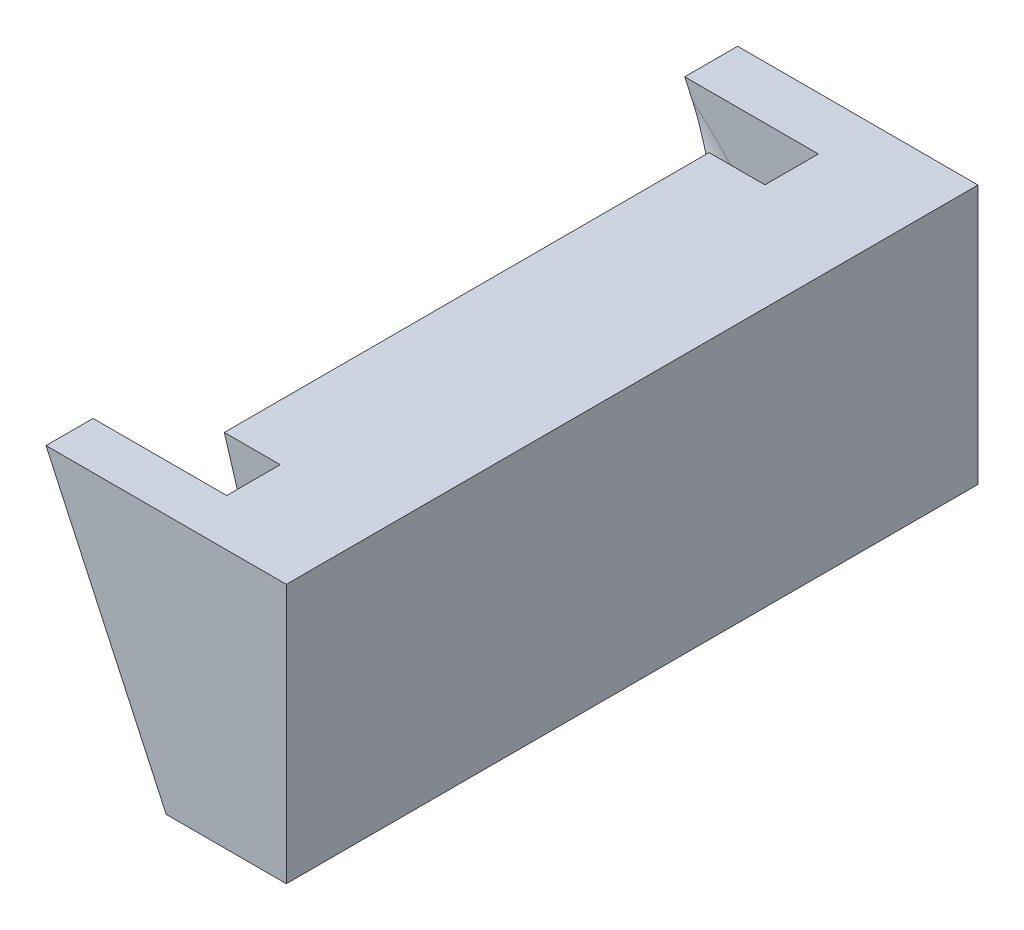
ISO-10303-21;
HEADER;
FILE_DESCRIPTION(('STEP AP214'),'2;1');
FILE_NAME('part.step','',(''),(''),'','','');
FILE_SCHEMA(('AUTOMOTIVE_DESIGN { 1 0 10303 214 1 1 1 1 }'));
ENDSEC;
DATA;
#1=APPLICATION_CONTEXT('core data for automotive mechanical design processes');
#2=APPLICATION_PROTOCOL_DEFINITION('international standard','automotive_design',2000,#1);
#3=PRODUCT_CONTEXT('',#1,'mechanical');
#4=PRODUCT('Part','Part','',(#3));
#5=PRODUCT_RELATED_PRODUCT_CATEGORY('part','',(#4));
#6=PRODUCT_DEFINITION_FORMATION('','',#4);
#7=PRODUCT_DEFINITION_CONTEXT('part definition',#1,'design');
#8=PRODUCT_DEFINITION('design','',#6,#7);
#9=PRODUCT_DEFINITION_SHAPE('','',#8);
#10=(LENGTH_UNIT() NAMED_UNIT(*) SI_UNIT(.MILLI.,.METRE.));
#11=(NAMED_UNIT(*) PLANE_ANGLE_UNIT() SI_UNIT($,.RADIAN.));
#12=(NAMED_UNIT(*) SI_UNIT($,.STERADIAN.) SOLID_ANGLE_UNIT());
#13=UNCERTAINTY_MEASURE_WITH_UNIT(LENGTH_MEASURE(1.E-05),#10,'distance_accuracy_value','');
#14=(GEOMETRIC_REPRESENTATION_CONTEXT(3) GLOBAL_UNCERTAINTY_ASSIGNED_CONTEXT((#13)) GLOBAL_UNIT_ASSIGNED_CONTEXT((#10,
#11,#12)) REPRESENTATION_CONTEXT('',''));
#15=CARTESIAN_POINT('',(0.,0.,0.));
#16=DIRECTION('',(0.,0.,1.));
#17=DIRECTION('',(1.,0.,0.));
#18=AXIS2_PLACEMENT_3D('',#15,#16,#17);
#19=CARTESIAN_POINT('',(13.5402836653134,-10.7818499465216,7.48868876928873));
#20=DIRECTION('',(0.,0.,-1.));
#21=DIRECTION('',(-1.,0.,0.));
#22=AXIS2_PLACEMENT_3D('',#19,#20,#21);
#23=PLANE('',#22);
#24=DIRECTION('',(-0.42050024365265,0.907292425344807,0.));
#25=VECTOR('',#24,1.);
#26=CARTESIAN_POINT('',(16.9459820272898,11.4679723498518,7.48868876928873));
#27=LINE('',#26,#25);
#28=CARTESIAN_POINT('',(16.9459820272898,11.4679723498518,7.48868876928873));
#29=VERTEX_POINT('',#28);
#30=CARTESIAN_POINT('',(13.5402836653134,18.8162780249916,7.48868876928873));
#31=VERTEX_POINT('',#30);
#32=EDGE_CURVE('E146',#29,#31,#27,.T.);
#33=ORIENTED_EDGE('',*,*,#32,.T.);
#34=DIRECTION('',(-1.,0.,0.));
#35=VECTOR('',#34,1.);
#36=CARTESIAN_POINT('',(13.5402836653134,18.8162780249916,7.48868876928873));
#37=LINE('',#36,#35);
#38=CARTESIAN_POINT('',(20.3516803892663,18.8162780249916,7.48868876928873));
#39=VERTEX_POINT('',#38);
#40=EDGE_CURVE('E269',#39,#31,#37,.T.);
#41=ORIENTED_EDGE('',*,*,#40,.F.);
#42=DIRECTION('',(0.,1.,0.));
#43=VECTOR('',#42,1.);
#44=CARTESIAN_POINT('',(20.3516803892663,-10.7818499465216,7.48868876928873));
#45=LINE('',#44,#43);
#46=CARTESIAN_POINT('',(20.3516803892663,11.4679723498518,7.48868876928873));
#47=VERTEX_POINT('',#46);
#48=EDGE_CURVE('E164',#47,#39,#45,.T.);
#49=ORIENTED_EDGE('',*,*,#48,.F.);
#50=DIRECTION('',(1.,0.,0.));
#51=VECTOR('',#50,1.);
#52=CARTESIAN_POINT('',(13.5402836653134,11.4679723498518,7.48868876928873));
#53=LINE('',#52,#51);
#54=EDGE_CURVE('E56',#29,#47,#53,.T.);
#55=ORIENTED_EDGE('',*,*,#54,.F.);
#56=EDGE_LOOP('',(#33,#41,#49,#55));
#57=FACE_BOUND('',#56,.T.);
#58=ADVANCED_FACE('F33',(#57),#23,.T.);
#59=CARTESIAN_POINT('',(20.3516803892663,-10.7818499465216,7.48868876928873));
#60=DIRECTION('',(1.,0.,0.));
#61=DIRECTION('',(0.,0.,-1.));
#62=AXIS2_PLACEMENT_3D('',#59,#60,#61);
#63=PLANE('',#62);
#64=DIRECTION('',(0.,0.,-1.));
#65=VECTOR('',#64,1.);
#66=CARTESIAN_POINT('',(20.3516803892663,18.8162780249916,27.0886887692887));
#67=LINE('',#66,#65);
#68=CARTESIAN_POINT('',(20.3516803892663,18.8162780249916,27.0886887692887));
#69=VERTEX_POINT('',#68);
#70=EDGE_CURVE('E267',#69,#39,#67,.T.);
#71=ORIENTED_EDGE('',*,*,#70,.F.);
#72=DIRECTION('',(0.,1.,0.));
#73=VECTOR('',#72,1.);
#74=CARTESIAN_POINT('',(20.3516803892663,-10.7818499465216,27.0886887692887));
#75=LINE('',#74,#73);
#76=CARTESIAN_POINT('',(20.3516803892663,11.4679723498518,27.0886887692887));
#77=VERTEX_POINT('',#76);
#78=EDGE_CURVE('E171',#77,#69,#75,.T.);
#79=ORIENTED_EDGE('',*,*,#78,.F.);
#80=DIRECTION('',(0.,0.,1.));
#81=VECTOR('',#80,1.);
#82=CARTESIAN_POINT('',(20.3516803892663,11.4679723498518,7.48868876928873));
#83=LINE('',#82,#81);
#84=EDGE_CURVE('E165',#47,#77,#83,.T.);
#85=ORIENTED_EDGE('',*,*,#84,.F.);
#86=ORIENTED_EDGE('',*,*,#48,.T.);
#87=EDGE_LOOP('',(#71,#79,#85,#86));
#88=FACE_BOUND('',#87,.T.);
#89=ADVANCED_FACE('F365',(#88),#63,.T.);
#90=CARTESIAN_POINT('',(13.5402836653134,-10.7818499465216,27.0886887692887));
#91=DIRECTION('',(0.,0.,1.));
#92=DIRECTION('',(1.,0.,0.));
#93=AXIS2_PLACEMENT_3D('',#90,#91,#92);
#94=PLANE('',#93);
#95=DIRECTION('',(-0.42050024365265,0.907292425344807,0.));
#96=VECTOR('',#95,1.);
#97=CARTESIAN_POINT('',(16.9459820272898,11.4679723498518,27.0886887692887));
#98=LINE('',#97,#96);
#99=CARTESIAN_POINT('',(16.9459820272898,11.4679723498518,27.0886887692887));
#100=VERTEX_POINT('',#99);
#101=CARTESIAN_POINT('',(13.5402836653134,18.8162780249916,27.0886887692887));
#102=VERTEX_POINT('',#101);
#103=EDGE_CURVE('E155',#100,#102,#98,.T.);
#104=ORIENTED_EDGE('',*,*,#103,.F.);
#105=DIRECTION('',(-1.,0.,0.));
#106=VECTOR('',#105,1.);
#107=CARTESIAN_POINT('',(13.5402836653134,11.4679723498518,27.0886887692887));
#108=LINE('',#107,#106);
#109=EDGE_CURVE('E41',#77,#100,#108,.T.);
#110=ORIENTED_EDGE('',*,*,#109,.F.);
#111=ORIENTED_EDGE('',*,*,#78,.T.);
#112=DIRECTION('',(1.,0.,0.));
#113=VECTOR('',#112,1.);
#114=CARTESIAN_POINT('',(13.5402836653134,18.8162780249916,27.0886887692887));
#115=LINE('',#114,#113);
#116=EDGE_CURVE('E261',#102,#69,#115,.T.);
#117=ORIENTED_EDGE('',*,*,#116,.F.);
#118=EDGE_LOOP('',(#104,#110,#111,#117));
#119=FACE_BOUND('',#118,.T.);
#120=ADVANCED_FACE('F35',(#119),#94,.T.);
#121=CARTESIAN_POINT('',(17.4160147169846,11.4679723498518,25.5886887692887));
#122=DIRECTION('',(0.,1.,0.));
#123=DIRECTION('',(-1.,0.,0.));
#124=AXIS2_PLACEMENT_3D('',#121,#122,#123);
#125=PLANE('',#124);
#126=ORIENTED_EDGE('',*,*,#109,.T.);
#127=DIRECTION('',(0.,0.,1.));
#128=VECTOR('',#127,1.);
#129=CARTESIAN_POINT('',(16.9459820272898,11.4679723498518,7.48868876928873));
#130=LINE('',#129,#128);
#131=EDGE_CURVE('E148',#29,#100,#130,.T.);
#132=ORIENTED_EDGE('',*,*,#131,.F.);
#133=ORIENTED_EDGE('',*,*,#54,.T.);
#134=ORIENTED_EDGE('',*,*,#84,.T.);
#135=EDGE_LOOP('',(#126,#132,#133,#134));
#136=FACE_BOUND('',#135,.T.);
#137=ADVANCED_FACE('F158',(#136),#125,.F.);
#138=CARTESIAN_POINT('',(115593.832044147,-381797.196196949,-21.8057488144853));
#139=DIRECTION('',(-0.957110448187778,-0.289723298976439,0.));
#140=DIRECTION('',(0.289723298976439,-0.957110448187778,0.));
#141=AXIS2_PLACEMENT_3D('',#138,#139,#140);
#142=PLANE('',#141);
#143=DIRECTION('',(-0.289723298976439,0.957110448187778,0.));
#144=VECTOR('',#143,1.);
#145=CARTESIAN_POINT('',(115593.832044147,-381797.196196949,10.5036887692887));
#146=LINE('',#145,#144);
#147=CARTESIAN_POINT('',(17.5102720274292,12.9844892930173,10.5036887692887));
#148=VERTEX_POINT('',#147);
#149=CARTESIAN_POINT('',(15.7449532248393,18.8162780249854,10.5036887692887));
#150=VERTEX_POINT('',#149);
#151=EDGE_CURVE('E293',#148,#150,#146,.T.);
#152=ORIENTED_EDGE('',*,*,#151,.F.);
#153=DIRECTION('',(0.,0.,1.));
#154=VECTOR('',#153,1.);
#155=CARTESIAN_POINT('',(17.5102720273574,12.9844892930317,-21.8057488144853));
#156=LINE('',#155,#154);
#157=CARTESIAN_POINT('',(17.5102720273574,12.9844892930317,24.2396887692887));
#158=VERTEX_POINT('',#157);
#159=EDGE_CURVE('E288',#148,#158,#156,.T.);
#160=ORIENTED_EDGE('',*,*,#159,.T.);
#161=DIRECTION('',(0.289723298976439,-0.957110448187778,0.));
#162=VECTOR('',#161,1.);
#163=CARTESIAN_POINT('',(115593.832044147,-381797.196196949,24.2396887692887));
#164=LINE('',#163,#162);
#165=CARTESIAN_POINT('',(15.7449532248393,18.8162780249885,24.2396887692887));
#166=VERTEX_POINT('',#165);
#167=EDGE_CURVE('E48',#166,#158,#164,.T.);
#168=ORIENTED_EDGE('',*,*,#167,.F.);
#169=DIRECTION('',(0.,0.,1.));
#170=VECTOR('',#169,1.);
#171=CARTESIAN_POINT('',(15.7449532248393,18.8162780249854,-21.8057488144853));
#172=LINE('',#171,#170);
#173=EDGE_CURVE('E273',#150,#166,#172,.T.);
#174=ORIENTED_EDGE('',*,*,#173,.F.);
#175=EDGE_LOOP('',(#152,#160,#168,#174));
#176=FACE_BOUND('',#175,.T.);
#177=ADVANCED_FACE('F350',(#176),#142,.T.);
#178=CARTESIAN_POINT('',(18.9602943565052,13.4234200910497,56.5491263529586));
#179=DIRECTION('',(-0.289723298976439,0.957110448187778,0.));
#180=DIRECTION('',(-0.957110448187778,-0.289723298976439,0.));
#181=AXIS2_PLACEMENT_3D('',#178,#179,#180);
#182=PLANE('',#181);
#183=DIRECTION('',(-0.957110448187778,-0.289723298976439,0.));
#184=VECTOR('',#183,1.);
#185=CARTESIAN_POINT('',(288431.362415068,87317.6554095615,10.5036887692887));
#186=LINE('',#185,#184);
#187=CARTESIAN_POINT('',(18.9602943565134,13.4234200910101,10.5036887692887));
#188=VERTEX_POINT('',#187);
#189=EDGE_CURVE('E295',#188,#148,#186,.T.);
#190=ORIENTED_EDGE('',*,*,#189,.F.);
#191=DIRECTION('',(0.,0.,-1.));
#192=VECTOR('',#191,1.);
#193=CARTESIAN_POINT('',(18.9602943565052,13.4234200910497,56.5491263529586));
#194=LINE('',#193,#192);
#195=CARTESIAN_POINT('',(18.9602943565052,13.4234200910497,8.98868876928873));
#196=VERTEX_POINT('',#195);
#197=EDGE_CURVE('E309',#188,#196,#194,.T.);
#198=ORIENTED_EDGE('',*,*,#197,.T.);
#199=DIRECTION('',(0.957110448187778,0.289723298976439,0.));
#200=VECTOR('',#199,1.);
#201=CARTESIAN_POINT('',(18.9602943565052,13.4234200910497,8.98868876928873));
#202=LINE('',#201,#200);
#203=CARTESIAN_POINT('',(17.5102720275007,12.9844892931004,8.98868876928873));
#204=VERTEX_POINT('',#203);
#205=EDGE_CURVE('E300',#204,#196,#202,.T.);
#206=ORIENTED_EDGE('',*,*,#205,.F.);
#207=DIRECTION('',(0.,0.,-1.));
#208=VECTOR('',#207,1.);
#209=CARTESIAN_POINT('',(17.5102720275007,12.9844892931004,25.7546887692887));
#210=LINE('',#209,#208);
#211=EDGE_CURVE('E320',#148,#204,#210,.T.);
#212=ORIENTED_EDGE('',*,*,#211,.F.);
#213=EDGE_LOOP('',(#190,#198,#206,#212));
#214=FACE_BOUND('',#213,.T.);
#215=ADVANCED_FACE('F360',(#214),#182,.T.);
#216=CARTESIAN_POINT('',(18.9602943565052,13.4234200910497,56.5491263529586));
#217=DIRECTION('',(-0.957110448187778,-0.289723298976438,0.));
#218=DIRECTION('',(0.289723298976438,-0.957110448187778,0.));
#219=AXIS2_PLACEMENT_3D('',#216,#217,#218);
#220=PLANE('',#219);
#221=DIRECTION('',(0.,0.,1.));
#222=VECTOR('',#221,1.);
#223=CARTESIAN_POINT('',(17.3278426426081,18.8162780249916,56.5491263529586));
#224=LINE('',#223,#222);
#225=CARTESIAN_POINT('',(17.3278426426081,18.8162780249916,8.98868876928873));
#226=VERTEX_POINT('',#225);
#227=CARTESIAN_POINT('',(17.3278426426293,18.8162780249885,10.5036887692887));
#228=VERTEX_POINT('',#227);
#229=EDGE_CURVE('E281',#226,#228,#224,.T.);
#230=ORIENTED_EDGE('',*,*,#229,.F.);
#231=DIRECTION('',(-0.289723298976438,0.957110448187778,0.));
#232=VECTOR('',#231,1.);
#233=CARTESIAN_POINT('',(18.9602943565052,13.4234200910497,8.98868876928873));
#234=LINE('',#233,#232);
#235=EDGE_CURVE('E302',#196,#226,#234,.T.);
#236=ORIENTED_EDGE('',*,*,#235,.F.);
#237=ORIENTED_EDGE('',*,*,#197,.F.);
#238=DIRECTION('',(0.289723298976439,-0.957110448187778,0.));
#239=VECTOR('',#238,1.);
#240=CARTESIAN_POINT('',(115595.282066476,-381796.757266151,10.5036887692887));
#241=LINE('',#240,#239);
#242=EDGE_CURVE('E298',#228,#188,#241,.T.);
#243=ORIENTED_EDGE('',*,*,#242,.F.);
#244=EDGE_LOOP('',(#230,#236,#237,#243));
#245=FACE_BOUND('',#244,.T.);
#246=ADVANCED_FACE('F209',(#245),#220,.T.);
#247=CARTESIAN_POINT('',(17.5102720275007,12.9844892931004,25.7546887692887));
#248=DIRECTION('',(0.,1.,0.));
#249=DIRECTION('',(-1.,0.,0.));
#250=AXIS2_PLACEMENT_3D('',#247,#248,#249);
#251=PLANE('',#250);
#252=DIRECTION('',(1.,0.,0.));
#253=VECTOR('',#252,1.);
#254=CARTESIAN_POINT('',(17.5102720275007,12.9844892931004,25.7546887692887));
#255=LINE('',#254,#253);
#256=CARTESIAN_POINT('',(16.9258961885882,12.9844892931004,25.7546887692887));
#257=VERTEX_POINT('',#256);
#258=CARTESIAN_POINT('',(17.5102720275007,12.9844892931004,25.7546887692887));
#259=VERTEX_POINT('',#258);
#260=EDGE_CURVE('E318',#257,#259,#255,.T.);
#261=ORIENTED_EDGE('',*,*,#260,.T.);
#262=EDGE_CURVE('E322',#259,#158,#210,.T.);
#263=ORIENTED_EDGE('',*,*,#262,.T.);
#264=ORIENTED_EDGE('',*,*,#159,.F.);
#265=ORIENTED_EDGE('',*,*,#211,.T.);
#266=DIRECTION('',(1.,0.,0.));
#267=VECTOR('',#266,1.);
#268=CARTESIAN_POINT('',(17.5102720275007,12.9844892931004,8.98868876928873));
#269=LINE('',#268,#267);
#270=CARTESIAN_POINT('',(16.9258961885882,12.9844892931004,8.98868876928873));
#271=VERTEX_POINT('',#270);
#272=EDGE_CURVE('E313',#271,#204,#269,.T.);
#273=ORIENTED_EDGE('',*,*,#272,.F.);
#274=CARTESIAN_POINT('',(16.6767837893273,12.9844892931004,9.01879543145996));
#275=CARTESIAN_POINT('',(16.7176982795765,12.9844892931004,9.00877857204223));
#276=CARTESIAN_POINT('',(16.7589148539871,12.9844892931004,9.00126125383565));
#277=CARTESIAN_POINT('',(16.8419523182663,12.9844892931004,8.99122568206261));
#278=CARTESIAN_POINT('',(16.8837732102761,12.9844892931004,8.98870744621212));
#279=CARTESIAN_POINT('',(16.9258961885882,12.9844892931004,8.98868876928873));
#280=B_SPLINE_CURVE_WITH_KNOTS('',3,(#274,#275,#276,#277,#278,#279),.UNSPECIFIED.,.F.,.F.,(4,2,
4),(0.,0.125689477333878,0.251379400090555),.UNSPECIFIED.);
#281=CARTESIAN_POINT('',(16.6767837893273,12.9844892931004,9.01879543145996));
#282=VERTEX_POINT('',#281);
#283=EDGE_CURVE('E178',#282,#271,#280,.T.);
#284=ORIENTED_EDGE('',*,*,#283,.F.);
#285=DIRECTION('',(0.,0.,-1.));
#286=VECTOR('',#285,1.);
#287=CARTESIAN_POINT('',(16.6767837893273,12.9844892931004,25.7546887692887));
#288=LINE('',#287,#286);
#289=CARTESIAN_POINT('',(16.6767837893273,12.9844892931004,25.7245821071175));
#290=VERTEX_POINT('',#289);
#291=EDGE_CURVE('E184',#290,#282,#288,.T.);
#292=ORIENTED_EDGE('',*,*,#291,.F.);
#293=CARTESIAN_POINT('',(16.9258961885882,12.9844892931004,25.7546887692887));
#294=CARTESIAN_POINT('',(16.8837732102761,12.9844892931004,25.7546700923653));
#295=CARTESIAN_POINT('',(16.8419523182663,12.9844892931004,25.7521518565149));
#296=CARTESIAN_POINT('',(16.7589148539871,12.9844892931004,25.7421162847418));
#297=CARTESIAN_POINT('',(16.7176982795765,12.9844892931004,25.7345989665352));
#298=CARTESIAN_POINT('',(16.6767837893273,12.9844892931004,25.7245821071175));
#299=B_SPLINE_CURVE_WITH_KNOTS('',3,(#293,#294,#295,#296,#297,#298),.UNSPECIFIED.,.F.,.F.,(4,2,
4),(0.,0.125689922756677,0.251379400090555),.UNSPECIFIED.);
#300=EDGE_CURVE('E173',#257,#290,#299,.T.);
#301=ORIENTED_EDGE('',*,*,#300,.F.);
#302=EDGE_LOOP('',(#261,#263,#264,#265,#273,#284,#292,#301));
#303=FACE_BOUND('',#302,.T.);
#304=ADVANCED_FACE('F204',(#303),#251,.T.);
#305=CARTESIAN_POINT('',(7.99028366537781,11.3162780249916,25.7546887692887));
#306=DIRECTION('',(0.,0.,1.));
#307=DIRECTION('',(1.,0.,0.));
#308=AXIS2_PLACEMENT_3D('',#305,#306,#307);
#309=PLANE('',#308);
#310=CARTESIAN_POINT('',(7.99028366537781,11.3162780249916,25.7546887692887));
#311=DIRECTION('',(0.,0.,1.));
#312=DIRECTION('',(1.,0.,0.));
#313=AXIS2_PLACEMENT_3D('',#310,#311,#312);
#314=CIRCLE('',#313,9.09);
#315=CARTESIAN_POINT('',(13.7613426965453,18.3393099670221,25.7546887692888));
#316=VERTEX_POINT('',#315);
#317=EDGE_CURVE('E325',#316,#257,#314,.F.);
#318=ORIENTED_EDGE('',*,*,#317,.F.);
#319=DIRECTION('',(-0.42050024365265,0.907292425344807,0.));
#320=VECTOR('',#319,1.);
#321=CARTESIAN_POINT('',(15.4203052849763,14.759849043672,25.7546887692887));
#322=LINE('',#321,#320);
#323=CARTESIAN_POINT('',(13.5402836653134,18.8162780249916,25.7546887692887));
#324=VERTEX_POINT('',#323);
#325=EDGE_CURVE('E265',#316,#324,#322,.T.);
#326=ORIENTED_EDGE('',*,*,#325,.T.);
#327=DIRECTION('',(1.,0.,0.));
#328=VECTOR('',#327,1.);
#329=CARTESIAN_POINT('',(7.99028366537781,18.8162780249916,25.7546887692887));
#330=LINE('',#329,#328);
#331=CARTESIAN_POINT('',(17.3278426426081,18.8162780249916,25.7546887692887));
#332=VERTEX_POINT('',#331);
#333=EDGE_CURVE('E264',#324,#332,#330,.T.);
#334=ORIENTED_EDGE('',*,*,#333,.T.);
#335=DIRECTION('',(-0.289723298976438,0.957110448187778,0.));
#336=VECTOR('',#335,1.);
#337=CARTESIAN_POINT('',(18.9602943565052,13.4234200910497,25.7546887692887));
#338=LINE('',#337,#336);
#339=CARTESIAN_POINT('',(18.9602943565052,13.4234200910497,25.7546887692887));
#340=VERTEX_POINT('',#339);
#341=EDGE_CURVE('E310',#340,#332,#338,.T.);
#342=ORIENTED_EDGE('',*,*,#341,.F.);
#343=DIRECTION('',(0.957110448187778,0.289723298976439,0.));
#344=VECTOR('',#343,1.);
#345=CARTESIAN_POINT('',(18.9602943565052,13.4234200910497,25.7546887692887));
#346=LINE('',#345,#344);
#347=EDGE_CURVE('E305',#259,#340,#346,.T.);
#348=ORIENTED_EDGE('',*,*,#347,.F.);
#349=ORIENTED_EDGE('',*,*,#260,.F.);
#350=EDGE_LOOP('',(#318,#326,#334,#342,#348,#349));
#351=FACE_BOUND('',#350,.T.);
#352=ADVANCED_FACE('F208',(#351),#309,.F.);
#353=CARTESIAN_POINT('',(7.99028366537781,11.3162780249916,8.98868876928873));
#354=DIRECTION('',(0.,0.,1.));
#355=DIRECTION('',(1.,0.,0.));
#356=AXIS2_PLACEMENT_3D('',#353,#354,#355);
#357=PLANE('',#356);
#358=DIRECTION('',(-0.42050024365265,0.907292425344807,0.));
#359=VECTOR('',#358,1.);
#360=CARTESIAN_POINT('',(15.4203052849763,14.759849043672,8.98868876928873));
#361=LINE('',#360,#359);
#362=CARTESIAN_POINT('',(13.7613426965453,18.3393099670221,8.98868876928855));
#363=VERTEX_POINT('',#362);
#364=CARTESIAN_POINT('',(13.5402836653134,18.8162780249916,8.98868876928873));
#365=VERTEX_POINT('',#364);
#366=EDGE_CURVE('E241',#363,#365,#361,.T.);
#367=ORIENTED_EDGE('',*,*,#366,.F.);
#368=CARTESIAN_POINT('',(7.99028366537781,11.3162780249916,8.98868876928873));
#369=DIRECTION('',(0.,0.,1.));
#370=DIRECTION('',(1.,0.,0.));
#371=AXIS2_PLACEMENT_3D('',#368,#369,#370);
#372=CIRCLE('',#371,9.09);
#373=EDGE_CURVE('E327',#271,#363,#372,.T.);
#374=ORIENTED_EDGE('',*,*,#373,.F.);
#375=ORIENTED_EDGE('',*,*,#272,.T.);
#376=ORIENTED_EDGE('',*,*,#205,.T.);
#377=ORIENTED_EDGE('',*,*,#235,.T.);
#378=DIRECTION('',(1.,0.,0.));
#379=VECTOR('',#378,1.);
#380=CARTESIAN_POINT('',(7.99028366537781,18.8162780249916,8.98868876928873));
#381=LINE('',#380,#379);
#382=EDGE_CURVE('E283',#365,#226,#381,.T.);
#383=ORIENTED_EDGE('',*,*,#382,.F.);
#384=EDGE_LOOP('',(#367,#374,#375,#376,#377,#383));
#385=FACE_BOUND('',#384,.T.);
#386=ADVANCED_FACE('F211',(#385),#357,.T.);
#387=ORIENTED_EDGE('',*,*,#262,.F.);
#388=ORIENTED_EDGE('',*,*,#347,.T.);
#389=CARTESIAN_POINT('',(18.9602943565134,13.4234200911105,24.2396887692887));
#390=VERTEX_POINT('',#389);
#391=EDGE_CURVE('E306',#340,#390,#194,.T.);
#392=ORIENTED_EDGE('',*,*,#391,.T.);
#393=DIRECTION('',(0.957110448187778,0.289723298976439,0.));
#394=VECTOR('',#393,1.);
#395=CARTESIAN_POINT('',(288431.362415068,87317.6554095615,24.2396887692887));
#396=LINE('',#395,#394);
#397=EDGE_CURVE('E289',#158,#390,#396,.T.);
#398=ORIENTED_EDGE('',*,*,#397,.F.);
#399=EDGE_LOOP('',(#387,#388,#392,#398));
#400=FACE_BOUND('',#399,.T.);
#401=ADVANCED_FACE('F347',(#400),#182,.T.);
#402=DIRECTION('',(0.,0.,1.));
#403=VECTOR('',#402,1.);
#404=CARTESIAN_POINT('',(17.3278426426081,18.8162780249916,56.5491263529586));
#405=LINE('',#404,#403);
#406=CARTESIAN_POINT('',(17.3278426426293,18.8162780249885,24.2396887692887));
#407=VERTEX_POINT('',#406);
#408=EDGE_CURVE('E275',#407,#332,#405,.T.);
#409=ORIENTED_EDGE('',*,*,#408,.F.);
#410=DIRECTION('',(-0.289723298976439,0.957110448187778,0.));
#411=VECTOR('',#410,1.);
#412=CARTESIAN_POINT('',(115595.282066476,-381796.757266151,24.2396887692887));
#413=LINE('',#412,#411);
#414=EDGE_CURVE('E285',#390,#407,#413,.T.);
#415=ORIENTED_EDGE('',*,*,#414,.F.);
#416=ORIENTED_EDGE('',*,*,#391,.F.);
#417=ORIENTED_EDGE('',*,*,#341,.T.);
#418=EDGE_LOOP('',(#409,#415,#416,#417));
#419=FACE_BOUND('',#418,.T.);
#420=ADVANCED_FACE('F380',(#419),#220,.T.);
#421=CARTESIAN_POINT('',(7.99028366537781,11.3162780249916,10.5036887692887));
#422=DIRECTION('',(0.,0.,1.));
#423=DIRECTION('',(1.,0.,0.));
#424=AXIS2_PLACEMENT_3D('',#421,#422,#423);
#425=PLANE('',#424);
#426=ORIENTED_EDGE('',*,*,#151,.T.);
#427=DIRECTION('',(1.,0.,0.));
#428=VECTOR('',#427,1.);
#429=CARTESIAN_POINT('',(7.99028366537781,18.8162780249916,10.5036887692887));
#430=LINE('',#429,#428);
#431=EDGE_CURVE('E278',#150,#228,#430,.T.);
#432=ORIENTED_EDGE('',*,*,#431,.T.);
#433=ORIENTED_EDGE('',*,*,#242,.T.);
#434=ORIENTED_EDGE('',*,*,#189,.T.);
#435=EDGE_LOOP('',(#426,#432,#433,#434));
#436=FACE_BOUND('',#435,.T.);
#437=ADVANCED_FACE('F355',(#436),#425,.F.);
#438=CARTESIAN_POINT('',(7.99028366537781,11.3162780249916,24.2396887692887));
#439=DIRECTION('',(0.,0.,1.));
#440=DIRECTION('',(1.,0.,0.));
#441=AXIS2_PLACEMENT_3D('',#438,#439,#440);
#442=PLANE('',#441);
#443=DIRECTION('',(1.,0.,0.));
#444=VECTOR('',#443,1.);
#445=CARTESIAN_POINT('',(7.99028366537781,18.8162780249916,24.2396887692887));
#446=LINE('',#445,#444);
#447=EDGE_CURVE('E11',#166,#407,#446,.T.);
#448=ORIENTED_EDGE('',*,*,#447,.F.);
#449=ORIENTED_EDGE('',*,*,#167,.T.);
#450=ORIENTED_EDGE('',*,*,#397,.T.);
#451=ORIENTED_EDGE('',*,*,#414,.T.);
#452=EDGE_LOOP('',(#448,#449,#450,#451));
#453=FACE_BOUND('',#452,.T.);
#454=ADVANCED_FACE('F227',(#453),#442,.T.);
#455=CARTESIAN_POINT('',(7.99028366537781,11.3162780249916,9.99868876928873));
#456=DIRECTION('',(0.,0.,1.));
#457=DIRECTION('',(1.,0.,0.));
#458=AXIS2_PLACEMENT_3D('',#455,#456,#457);
#459=TOROIDAL_SURFACE('',#458,9.09,1.01);
#460=ORIENTED_EDGE('',*,*,#373,.T.);
#461=CARTESIAN_POINT('',(13.6273441058182,18.6284320500856,8.99883045461228));
#462=CARTESIAN_POINT('',(13.6624006490265,18.5527922934106,8.99335457269035));
#463=CARTESIAN_POINT('',(13.697507652362,18.4770436614331,8.99022174661133));
#464=CARTESIAN_POINT('',(13.7677218887587,18.3255459018106,8.98803872350333));
#465=CARTESIAN_POINT('',(13.8028291048734,18.2497968107302,8.98898570479964));
#466=CARTESIAN_POINT('',(13.8728917427383,18.0986261477067,8.9943452611441));
#467=CARTESIAN_POINT('',(13.9078473118796,18.0232042577452,8.99874794692776));
#468=CARTESIAN_POINT('',(13.9776743708196,17.8725418916309,9.0105233222604));
#469=CARTESIAN_POINT('',(14.0125458432627,17.7973014529252,9.01789657956522));
#470=CARTESIAN_POINT('',(14.1160465039602,17.5739832340027,9.04357526840076));
#471=CARTESIAN_POINT('',(14.184514999139,17.4262521732288,9.06553791835222));
#472=CARTESIAN_POINT('',(14.3210142832463,17.1317344686498,9.11640014670971));
#473=CARTESIAN_POINT('',(14.3890447796959,16.9849484559115,9.14530394848092));
#474=CARTESIAN_POINT('',(14.4901048792238,16.7668961142298,9.19146674133821));
#475=CARTESIAN_POINT('',(14.5232665784112,16.6953447680926,9.20713445529384));
#476=CARTESIAN_POINT('',(14.5730054293161,16.5880257276104,9.23114670229879));
#477=CARTESIAN_POINT('',(14.5896035264702,16.5522128403401,9.23924551138968));
#478=CARTESIAN_POINT('',(14.6227901773188,16.4806076572469,9.25555892906123));
#479=CARTESIAN_POINT('',(14.6393787306715,16.4448153621615,9.26377354154925));
#480=CARTESIAN_POINT('',(14.7300143849698,16.2492553265794,9.30887317716026));
#481=CARTESIAN_POINT('',(14.8039991262999,16.089622136318,9.34647944278399));
#482=CARTESIAN_POINT('',(14.9152545822155,15.8495717821168,9.39983308318968));
#483=CARTESIAN_POINT('',(14.952392814869,15.769440467841,9.41711116340823));
#484=CARTESIAN_POINT('',(15.0268318792818,15.6088270072998,9.44964236960866));
#485=CARTESIAN_POINT('',(15.0641327219301,15.5283448375398,9.46489535776366));
#486=CARTESIAN_POINT('',(15.1388574504836,15.3671150137147,9.49215520989185));
#487=CARTESIAN_POINT('',(15.1762808182384,15.2863684776367,9.504169860383));
#488=CARTESIAN_POINT('',(15.2513328463596,15.1244324558413,9.5236923670951));
#489=CARTESIAN_POINT('',(15.2889614444131,15.0432431045731,9.53120152195239));
#490=CARTESIAN_POINT('',(15.3642827901307,14.880725989618,9.54064164796283));
#491=CARTESIAN_POINT('',(15.4019753110078,14.7993987152581,9.54258233773123));
#492=CARTESIAN_POINT('',(15.4773333187399,14.636802496501,9.54060289395186));
#493=CARTESIAN_POINT('',(15.5149988040374,14.555533555464,9.53668244624589));
#494=CARTESIAN_POINT('',(15.6101441013924,14.3502432877404,9.5200924499628));
#495=CARTESIAN_POINT('',(15.6675103548593,14.2264669807664,9.50387919406589));
#496=CARTESIAN_POINT('',(15.7818523352639,13.9797569864537,9.46353861869278));
#497=CARTESIAN_POINT('',(15.838826678408,13.8568262848575,9.43939105297142));
#498=CARTESIAN_POINT('',(15.9247562361391,13.6714203593687,9.40007803094695));
#499=CARTESIAN_POINT('',(15.9538262898891,13.6086973527358,9.38627482554495));
#500=CARTESIAN_POINT('',(16.011918871432,13.48335388386,9.35811121868564));
#501=CARTESIAN_POINT('',(16.0409413991333,13.4207334218146,9.34375081615647));
#502=CARTESIAN_POINT('',(16.0988322550589,13.2958252062527,9.3149142355141));
#503=CARTESIAN_POINT('',(16.1277006614245,13.2335372841345,9.30043893027259));
#504=CARTESIAN_POINT('',(16.1854463362799,13.1089423185344,9.27160105473143));
#505=CARTESIAN_POINT('',(16.2143236044233,13.0466352757999,9.25723848049513));
#506=CARTESIAN_POINT('',(16.2432189199617,12.9842892931003,9.24307942513646));
#507=B_SPLINE_CURVE_WITH_KNOTS('',3,(#461,#462,#463,#464,#465,#466,#467,#468,#469,#470,#471,
#472,#473,#474,#475,#476,#477,#478,#479,#480,#481,#482,#483,#484,#485,#486,#487,#488,#489,#490,
#491,#492,#493,#494,#495,#496,#497,#498,#499,#500,#501,#502,#503,#504,#505,#506),.UNSPECIFIED.,
.F.,.F.,(4,2,2,2,2,2,2,2,2,2,2,2,2,2,2,2,2,2,2,2,2,2,4),(0.,0.250562990714489,0.50095271498541,
0.750628494512535,1.00035201642877,1.4930061069568,1.985960717273,2.22717025682089,
2.34805353775831,2.46894090726735,3.00868266646595,3.27865046331376,3.54863662464485,
3.81796769811372,4.08722110391105,4.35600429635163,4.62480189614444,5.03652740359195,
5.44931179161256,5.66080117814302,5.87229097152676,6.08277708498186,6.2932558151282),.UNSPECIFIED.);
#508=CARTESIAN_POINT('',(16.1834992029204,13.1131435511731,9.27259705895707));
#509=VERTEX_POINT('',#508);
#510=EDGE_CURVE('E233',#363,#509,#507,.T.);
#511=ORIENTED_EDGE('',*,*,#510,.T.);
#512=CARTESIAN_POINT('',(16.6767837893273,12.9844892931004,9.01879543145996));
#513=CARTESIAN_POINT('',(16.6506956533822,12.9844861640728,9.02519110428056));
#514=CARTESIAN_POINT('',(16.6248720895523,12.9855001287535,9.03254846166332));
#515=CARTESIAN_POINT('',(16.5739810658833,12.9894120595705,9.04899959556113));
#516=CARTESIAN_POINT('',(16.5489122825185,12.9923064993257,9.05809009947575));
#517=CARTESIAN_POINT('',(16.4756496341665,13.0034978553053,9.08747596004328));
#518=CARTESIAN_POINT('',(16.4287379564632,13.0143106768286,9.11005486134209));
#519=CARTESIAN_POINT('',(16.3289486669155,13.0445265259268,9.16565477441219));
#520=CARTESIAN_POINT('',(16.2771919552899,13.0653359401098,9.19988307644786));
#521=CARTESIAN_POINT('',(16.1803498258378,13.1132454813134,9.27344482871174));
#522=CARTESIAN_POINT('',(16.1353035794749,13.1403803417016,9.31280591748306));
#523=CARTESIAN_POINT('',(16.0340560080774,13.2119755215295,9.41254113205624));
#524=CARTESIAN_POINT('',(15.9813440349347,13.2588778830764,9.47469297214041));
#525=CARTESIAN_POINT('',(15.8886453910271,13.3591901067301,9.60274352381499));
#526=CARTESIAN_POINT('',(15.8486561154001,13.4125986336551,9.6686414651628));
#527=CARTESIAN_POINT('',(15.7711605025032,13.5396428065801,9.82068828737192));
#528=CARTESIAN_POINT('',(15.7373059741296,13.6148223184184,9.90745850019317));
#529=CARTESIAN_POINT('',(15.7124808536906,13.6941196059011,9.99559029522602));
#530=CARTESIAN_POINT('',(15.7120474660043,13.6955145022805,9.99713956750644));
#531=CARTESIAN_POINT('',(15.7116171088885,13.6969102633105,9.99868876928873));
#532=B_SPLINE_CURVE_WITH_KNOTS('',3,(#512,#513,#514,#515,#516,#517,#518,#519,#520,#521,#522,
#523,#524,#525,#526,#527,#528,#529,#530,#531),.UNSPECIFIED.,.F.,.F.,(4,2,2,2,2,2,2,2,2,4),(0.,
0.080498650708449,0.160846779495429,0.319528499497505,0.514822999597298,0.711216241837303,
0.99175154115831,1.27222936628923,1.62920385617823,1.63559166412485),.UNSPECIFIED.);
#533=EDGE_CURVE('E220',#509,#282,#532,.F.);
#534=ORIENTED_EDGE('',*,*,#533,.T.);
#535=ORIENTED_EDGE('',*,*,#283,.T.);
#536=EDGE_LOOP('',(#460,#511,#534,#535));
#537=FACE_BOUND('',#536,.T.);
#538=ADVANCED_FACE('F217',(#537),#459,.F.);
#539=CARTESIAN_POINT('',(16.6767837893273,13.9944892931004,25.7546887692887));
#540=DIRECTION('',(0.,0.,-1.));
#541=DIRECTION('',(-1.,0.,0.));
#542=AXIS2_PLACEMENT_3D('',#539,#540,#541);
#543=CYLINDRICAL_SURFACE('',#542,1.01);
#544=ORIENTED_EDGE('',*,*,#533,.F.);
#545=DIRECTION('',(0.,0.,-1.));
#546=VECTOR('',#545,1.);
#547=CARTESIAN_POINT('',(16.1834992029204,13.1131435511731,25.7546887692887));
#548=LINE('',#547,#546);
#549=CARTESIAN_POINT('',(16.1834992029203,13.1131435511732,25.4707804796096));
#550=VERTEX_POINT('',#549);
#551=EDGE_CURVE('E242',#509,#550,#548,.F.);
#552=ORIENTED_EDGE('',*,*,#551,.T.);
#553=CARTESIAN_POINT('',(16.6767837893273,12.9844892931004,25.7245821071175));
#554=CARTESIAN_POINT('',(16.6506956533822,12.9844861640728,25.7181864342969));
#555=CARTESIAN_POINT('',(16.6248720895523,12.9855001287535,25.7108290769141));
#556=CARTESIAN_POINT('',(16.5739810658833,12.9894120595705,25.6943779430163));
#557=CARTESIAN_POINT('',(16.5489122825185,12.9923064993257,25.6852874391017));
#558=CARTESIAN_POINT('',(16.4756496341665,13.0034978553053,25.6559015785342));
#559=CARTESIAN_POINT('',(16.4287379564632,13.0143106768286,25.6333226772354));
#560=CARTESIAN_POINT('',(16.3289486669155,13.0445265259268,25.5777227641653));
#561=CARTESIAN_POINT('',(16.2771919552899,13.0653359401098,25.5434944621296));
#562=CARTESIAN_POINT('',(16.1803498258378,13.1132454813134,25.4699327098657));
#563=CARTESIAN_POINT('',(16.1353035794749,13.1403803417015,25.4305716210944));
#564=CARTESIAN_POINT('',(16.0340560080774,13.2119755215295,25.3308364065213));
#565=CARTESIAN_POINT('',(15.9813440349347,13.2588778830766,25.2686845664372));
#566=CARTESIAN_POINT('',(15.8886453910272,13.3591901067299,25.1406340147623));
#567=CARTESIAN_POINT('',(15.8486561154003,13.4125986336545,25.0747360734141));
#568=CARTESIAN_POINT('',(15.771160502503,13.5396428065809,24.9226892512063));
#569=CARTESIAN_POINT('',(15.7373059741286,13.6148223184215,24.8359190383874));
#570=CARTESIAN_POINT('',(15.7124808536906,13.6941196059012,24.7477872433516));
#571=CARTESIAN_POINT('',(15.7120474660043,13.6955145022805,24.7462379710711));
#572=CARTESIAN_POINT('',(15.7116171088885,13.6969102633105,24.7446887692887));
#573=B_SPLINE_CURVE_WITH_KNOTS('',3,(#553,#554,#555,#556,#557,#558,#559,#560,#561,#562,#563,
#564,#565,#566,#567,#568,#569,#570,#571,#572),.UNSPECIFIED.,.F.,.F.,(4,2,2,2,2,2,2,2,2,4),(0.,
0.0804986507084413,0.160846779495422,0.319528499497504,0.514822999597304,0.711216241837302,
0.991751541158299,1.27222936628924,1.62920385617824,1.63559166412485),.UNSPECIFIED.);
#574=EDGE_CURVE('E197',#550,#290,#573,.F.);
#575=ORIENTED_EDGE('',*,*,#574,.T.);
#576=ORIENTED_EDGE('',*,*,#291,.T.);
#577=EDGE_LOOP('',(#544,#552,#575,#576));
#578=FACE_BOUND('',#577,.T.);
#579=ADVANCED_FACE('F213',(#578),#543,.F.);
#580=CARTESIAN_POINT('',(7.99028366537781,11.3162780249916,24.7446887692887));
#581=DIRECTION('',(0.,0.,1.));
#582=DIRECTION('',(1.,0.,0.));
#583=AXIS2_PLACEMENT_3D('',#580,#581,#582);
#584=TOROIDAL_SURFACE('',#583,9.09,1.01);
#585=ORIENTED_EDGE('',*,*,#574,.F.);
#586=CARTESIAN_POINT('',(16.2432189199617,12.9842892931003,25.500298113441));
#587=CARTESIAN_POINT('',(16.2079117132318,13.060469893967,25.4830062269306));
#588=CARTESIAN_POINT('',(16.1726330871688,13.1365888277529,25.4653979676194));
#589=CARTESIAN_POINT('',(16.102077627597,13.2888228276198,25.4301101835287));
#590=CARTESIAN_POINT('',(16.0668007948269,13.364937892107,25.4124306503499));
#591=CARTESIAN_POINT('',(15.9958830858139,13.5179534995448,25.3774087290502));
#592=CARTESIAN_POINT('',(15.9602418008509,13.5948549243705,25.3600708319694));
#593=CARTESIAN_POINT('',(15.8888587732148,13.7488745266183,25.3266512615347));
#594=CARTESIAN_POINT('',(15.8531170306839,13.8259927037331,25.3105695864005));
#595=CARTESIAN_POINT('',(15.7486889208294,14.0513120334939,25.2668627903126));
#596=CARTESIAN_POINT('',(15.6797577286399,14.2000414325552,25.2421259657449));
#597=CARTESIAN_POINT('',(15.575976040849,14.4239660096357,25.2169854833689));
#598=CARTESIAN_POINT('',(15.5413909414449,14.4985885555029,25.210600397248));
#599=CARTESIAN_POINT('',(15.4721239801765,14.6480424267766,25.2025649627339));
#600=CARTESIAN_POINT('',(15.4374421334611,14.7228737194973,25.2009139106245));
#601=CARTESIAN_POINT('',(15.3716442611776,14.8648425103072,25.2024804647663));
#602=CARTESIAN_POINT('',(15.3405259711832,14.9319848942362,25.2052178469688));
#603=CARTESIAN_POINT('',(15.2783831576562,15.0660673468715,25.2143811715232));
#604=CARTESIAN_POINT('',(15.2473586512238,15.1330073786813,25.2208077500552));
#605=CARTESIAN_POINT('',(15.1543621519768,15.333661291786,25.2447414483838));
#606=CARTESIAN_POINT('',(15.0926080583695,15.4669050228176,25.2668944068518));
#607=CARTESIAN_POINT('',(14.9690998745895,15.7333924774699,25.3179828533594));
#608=CARTESIAN_POINT('',(14.9073503368707,15.8666263784878,25.3469749427923));
#609=CARTESIAN_POINT('',(14.7840772440166,16.1326065891621,25.4070859752065));
#610=CARTESIAN_POINT('',(14.7225535750849,16.2653531443514,25.4382036254152));
#611=CARTESIAN_POINT('',(14.5769676327321,16.5794766787066,25.5106765377133));
#612=CARTESIAN_POINT('',(14.4928687448625,16.7609326590438,25.5516265127939));
#613=CARTESIAN_POINT('',(14.324119244747,17.1250350479166,25.625982194701));
#614=CARTESIAN_POINT('',(14.2394691750043,17.3076802859202,25.6593944217159));
#615=CARTESIAN_POINT('',(14.1123769812043,17.5819007804281,25.6998083594569));
#616=CARTESIAN_POINT('',(14.0702089414879,17.672884658806,25.7116262221614));
#617=CARTESIAN_POINT('',(13.98572254981,17.855176736804,25.7314177072912));
#618=CARTESIAN_POINT('',(13.9434042442088,17.9464848363947,25.739392426484));
#619=CARTESIAN_POINT('',(13.8584751379415,18.129732137605,25.7507400412062));
#620=CARTESIAN_POINT('',(13.8158638501537,18.2216723902628,25.7540938727233));
#621=CARTESIAN_POINT('',(13.7305888748428,18.4056659558763,25.7551355599212));
#622=CARTESIAN_POINT('',(13.6879251787163,18.4977192873954,25.7528175502725));
#623=CARTESIAN_POINT('',(13.6453129116257,18.589661653046,25.7471572235574));
#624=B_SPLINE_CURVE_WITH_KNOTS('',3,(#586,#587,#588,#589,#590,#591,#592,#593,#594,#595,#596,
#597,#598,#599,#600,#601,#602,#603,#604,#605,#606,#607,#608,#609,#610,#611,#612,#613,#614,#615,
#616,#617,#618,#619,#620,#621,#622,#623),.UNSPECIFIED.,.F.,.F.,(4,2,2,2,2,2,2,2,2,2,2,2,2,2,2,2,
2,2,4),(0.,0.257175823553806,0.514382896256534,0.773914513455643,1.03344576287191,
1.53025308387604,1.77762113438626,2.02495241161524,2.24701231974845,2.46911053231218,
2.91430848046554,3.36332887713523,3.81207856890202,4.42449112971253,5.03637190202325,
5.339235741367,5.64201309728931,5.94603589358495,6.25037321692272),.UNSPECIFIED.);
#625=EDGE_CURVE('E160',#550,#316,#624,.T.);
#626=ORIENTED_EDGE('',*,*,#625,.T.);
#627=ORIENTED_EDGE('',*,*,#317,.T.);
#628=ORIENTED_EDGE('',*,*,#300,.T.);
#629=EDGE_LOOP('',(#585,#626,#627,#628));
#630=FACE_BOUND('',#629,.T.);
#631=ADVANCED_FACE('F202',(#630),#584,.F.);
#632=CARTESIAN_POINT('',(0.,18.8162780249916,0.));
#633=DIRECTION('',(0.,-1.,0.));
#634=DIRECTION('',(0.,0.,-1.));
#635=AXIS2_PLACEMENT_3D('',#632,#633,#634);
#636=PLANE('',#635);
#637=ORIENTED_EDGE('',*,*,#382,.T.);
#638=ORIENTED_EDGE('',*,*,#229,.T.);
#639=ORIENTED_EDGE('',*,*,#431,.F.);
#640=ORIENTED_EDGE('',*,*,#173,.T.);
#641=ORIENTED_EDGE('',*,*,#447,.T.);
#642=ORIENTED_EDGE('',*,*,#408,.T.);
#643=ORIENTED_EDGE('',*,*,#333,.F.);
#644=DIRECTION('',(0.,0.,1.));
#645=VECTOR('',#644,1.);
#646=CARTESIAN_POINT('',(13.5402836653134,18.8162780249916,27.0886887692887));
#647=LINE('',#646,#645);
#648=EDGE_CURVE('E257',#324,#102,#647,.T.);
#649=ORIENTED_EDGE('',*,*,#648,.T.);
#650=ORIENTED_EDGE('',*,*,#116,.T.);
#651=ORIENTED_EDGE('',*,*,#70,.T.);
#652=ORIENTED_EDGE('',*,*,#40,.T.);
#653=EDGE_CURVE('E151',#31,#365,#647,.T.);
#654=ORIENTED_EDGE('',*,*,#653,.T.);
#655=EDGE_LOOP('',(#637,#638,#639,#640,#641,#642,#643,#649,#650,#651,#652,#654));
#656=FACE_BOUND('',#655,.T.);
#657=ADVANCED_FACE('F248',(#656),#636,.F.);
#658=CARTESIAN_POINT('',(16.9459820272898,11.4679723498518,7.48868876928873));
#659=DIRECTION('',(0.907292425344807,0.42050024365265,0.));
#660=DIRECTION('',(-0.42050024365265,0.907292425344807,0.));
#661=AXIS2_PLACEMENT_3D('',#658,#659,#660);
#662=PLANE('',#661);
#663=ORIENTED_EDGE('',*,*,#625,.F.);
#664=ORIENTED_EDGE('',*,*,#551,.F.);
#665=ORIENTED_EDGE('',*,*,#510,.F.);
#666=ORIENTED_EDGE('',*,*,#366,.T.);
#667=ORIENTED_EDGE('',*,*,#653,.F.);
#668=ORIENTED_EDGE('',*,*,#32,.F.);
#669=ORIENTED_EDGE('',*,*,#131,.T.);
#670=ORIENTED_EDGE('',*,*,#103,.T.);
#671=ORIENTED_EDGE('',*,*,#648,.F.);
#672=ORIENTED_EDGE('',*,*,#325,.F.);
#673=EDGE_LOOP('',(#663,#664,#665,#666,#667,#668,#669,#670,#671,#672));
#674=FACE_BOUND('',#673,.T.);
#675=ADVANCED_FACE('F147',(#674),#662,.F.);
#676=CLOSED_SHELL('',(#58,#89,#120,#137,#177,#215,#246,#304,#352,#386,#401,#420,#437,#454,#538,
#579,#631,#657,#675));
#677=MANIFOLD_SOLID_BREP('B2',#676);
#678=ADVANCED_BREP_SHAPE_REPRESENTATION('',(#18,#677),#14);
#679=SHAPE_DEFINITION_REPRESENTATION(#9,#678);
ENDSEC;
END-ISO-10303-21;
